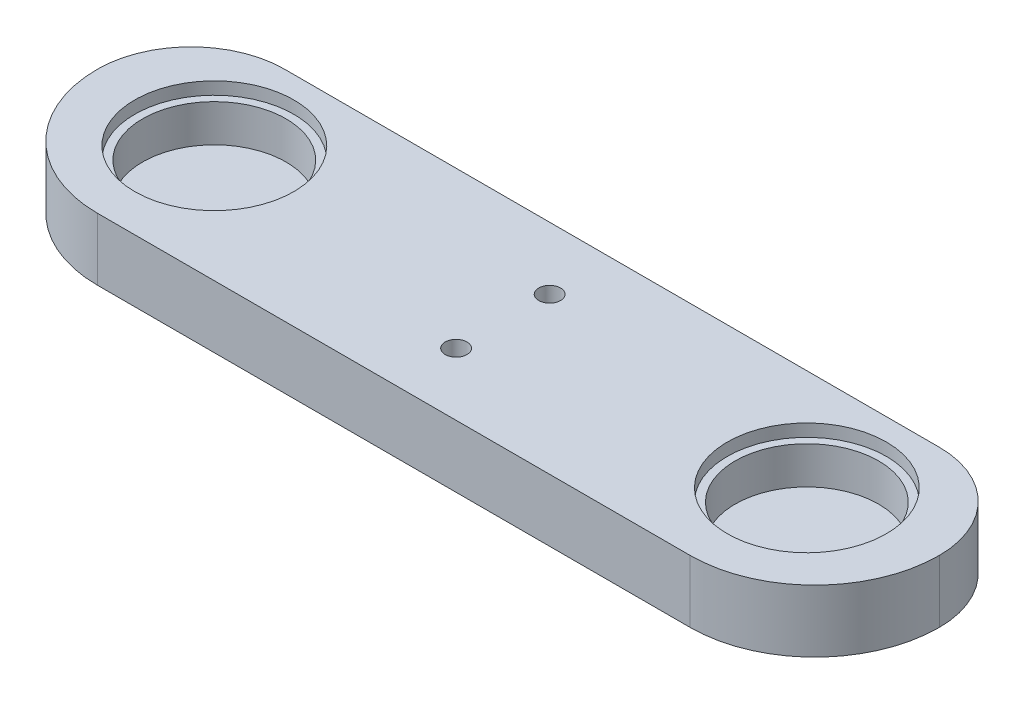
ISO-10303-21;
HEADER;
FILE_DESCRIPTION(('STEP AP214'),'2;1');
FILE_NAME('part.step','',(''),(''),'','','');
FILE_SCHEMA(('AUTOMOTIVE_DESIGN { 1 0 10303 214 1 1 1 1 }'));
ENDSEC;
DATA;
#1=APPLICATION_CONTEXT('core data for automotive mechanical design processes');
#2=APPLICATION_PROTOCOL_DEFINITION('international standard','automotive_design',2000,#1);
#3=PRODUCT_CONTEXT('',#1,'mechanical');
#4=PRODUCT('Part','Part','',(#3));
#5=PRODUCT_RELATED_PRODUCT_CATEGORY('part','',(#4));
#6=PRODUCT_DEFINITION_FORMATION('','',#4);
#7=PRODUCT_DEFINITION_CONTEXT('part definition',#1,'design');
#8=PRODUCT_DEFINITION('design','',#6,#7);
#9=PRODUCT_DEFINITION_SHAPE('','',#8);
#10=(LENGTH_UNIT() NAMED_UNIT(*) SI_UNIT(.MILLI.,.METRE.));
#11=(NAMED_UNIT(*) PLANE_ANGLE_UNIT() SI_UNIT($,.RADIAN.));
#12=(NAMED_UNIT(*) SI_UNIT($,.STERADIAN.) SOLID_ANGLE_UNIT());
#13=UNCERTAINTY_MEASURE_WITH_UNIT(LENGTH_MEASURE(1.E-05),#10,'distance_accuracy_value','');
#14=(GEOMETRIC_REPRESENTATION_CONTEXT(3) GLOBAL_UNCERTAINTY_ASSIGNED_CONTEXT((#13)) GLOBAL_UNIT_ASSIGNED_CONTEXT((#10,
#11,#12)) REPRESENTATION_CONTEXT('',''));
#15=CARTESIAN_POINT('',(0.,0.,0.));
#16=DIRECTION('',(0.,0.,1.));
#17=DIRECTION('',(1.,0.,0.));
#18=AXIS2_PLACEMENT_3D('',#15,#16,#17);
#19=CARTESIAN_POINT('',(19.7497982410927,-0.000999999999999265,15.6230701462917));
#20=DIRECTION('',(0.,1.,0.));
#21=DIRECTION('',(0.,0.,1.));
#22=AXIS2_PLACEMENT_3D('',#19,#20,#21);
#23=CYLINDRICAL_SURFACE('',#22,1.75);
#24=CARTESIAN_POINT('',(19.7497982410927,10.,15.6230701462917));
#25=DIRECTION('',(0.,1.,0.));
#26=DIRECTION('',(0.,0.,1.));
#27=AXIS2_PLACEMENT_3D('',#24,#25,#26);
#28=CIRCLE('',#27,1.75);
#29=CARTESIAN_POINT('',(19.7497982410927,10.,17.3730701462917));
#30=VERTEX_POINT('',#29);
#31=EDGE_CURVE('E134',#30,#30,#28,.T.);
#32=ORIENTED_EDGE('',*,*,#31,.T.);
#33=EDGE_LOOP('',(#32));
#34=FACE_BOUND('',#33,.T.);
#35=CARTESIAN_POINT('',(19.7497982410927,4.,15.6230701462917));
#36=DIRECTION('',(0.,-1.,0.));
#37=DIRECTION('',(0.,0.,-1.));
#38=AXIS2_PLACEMENT_3D('',#35,#36,#37);
#39=CIRCLE('',#38,1.75);
#40=CARTESIAN_POINT('',(19.7497982410927,4.,13.8730701462917));
#41=VERTEX_POINT('',#40);
#42=EDGE_CURVE('E130',#41,#41,#39,.F.);
#43=ORIENTED_EDGE('',*,*,#42,.F.);
#44=EDGE_LOOP('',(#43));
#45=FACE_BOUND('',#44,.T.);
#46=ADVANCED_FACE('F33',(#34,#45),#23,.F.);
#47=CARTESIAN_POINT('',(19.7497982410927,-0.000999999999999265,0.623070146291696));
#48=DIRECTION('',(0.,1.,0.));
#49=DIRECTION('',(0.,0.,1.));
#50=AXIS2_PLACEMENT_3D('',#47,#48,#49);
#51=CYLINDRICAL_SURFACE('',#50,1.75);
#52=CARTESIAN_POINT('',(19.7497982410927,10.,0.623070146291696));
#53=DIRECTION('',(0.,1.,0.));
#54=DIRECTION('',(0.,0.,1.));
#55=AXIS2_PLACEMENT_3D('',#52,#53,#54);
#56=CIRCLE('',#55,1.75);
#57=CARTESIAN_POINT('',(19.7497982410927,10.,2.37307014629169));
#58=VERTEX_POINT('',#57);
#59=EDGE_CURVE('E188',#58,#58,#56,.T.);
#60=ORIENTED_EDGE('',*,*,#59,.T.);
#61=EDGE_LOOP('',(#60));
#62=FACE_BOUND('',#61,.T.);
#63=CARTESIAN_POINT('',(19.7497982410927,4.,0.623070146291696));
#64=DIRECTION('',(0.,-1.,0.));
#65=DIRECTION('',(0.,0.,-1.));
#66=AXIS2_PLACEMENT_3D('',#63,#64,#65);
#67=CIRCLE('',#66,1.75);
#68=CARTESIAN_POINT('',(19.7497982410927,4.,-1.1269298537083));
#69=VERTEX_POINT('',#68);
#70=EDGE_CURVE('E127',#69,#69,#67,.F.);
#71=ORIENTED_EDGE('',*,*,#70,.F.);
#72=EDGE_LOOP('',(#71));
#73=FACE_BOUND('',#72,.T.);
#74=ADVANCED_FACE('F238',(#62,#73),#51,.F.);
#75=CARTESIAN_POINT('',(-47.7502017589073,10.,25.6230701462917));
#76=DIRECTION('',(0.,0.,-1.));
#77=DIRECTION('',(-1.,0.,0.));
#78=AXIS2_PLACEMENT_3D('',#75,#76,#77);
#79=PLANE('',#78);
#80=DIRECTION('',(1.,0.,0.));
#81=VECTOR('',#80,1.);
#82=CARTESIAN_POINT('',(-47.7502017589073,0.,25.6230701462917));
#83=LINE('',#82,#81);
#84=CARTESIAN_POINT('',(-27.7502017589073,0.,25.6230701462917));
#85=VERTEX_POINT('',#84);
#86=CARTESIAN_POINT('',(67.2497982410927,0.,25.6230701462917));
#87=VERTEX_POINT('',#86);
#88=EDGE_CURVE('E148',#85,#87,#83,.T.);
#89=ORIENTED_EDGE('',*,*,#88,.T.);
#90=DIRECTION('',(0.,-1.,0.));
#91=VECTOR('',#90,1.);
#92=CARTESIAN_POINT('',(67.2497982410927,10.,25.6230701462917));
#93=LINE('',#92,#91);
#94=CARTESIAN_POINT('',(67.2497982410927,10.,25.6230701462917));
#95=VERTEX_POINT('',#94);
#96=EDGE_CURVE('E103',#87,#95,#93,.F.);
#97=ORIENTED_EDGE('',*,*,#96,.T.);
#98=DIRECTION('',(1.,0.,0.));
#99=VECTOR('',#98,1.);
#100=CARTESIAN_POINT('',(-47.7502017589073,10.,25.6230701462917));
#101=LINE('',#100,#99);
#102=CARTESIAN_POINT('',(-27.7502017589073,10.,25.6230701462917));
#103=VERTEX_POINT('',#102);
#104=EDGE_CURVE('E112',#103,#95,#101,.T.);
#105=ORIENTED_EDGE('',*,*,#104,.F.);
#106=DIRECTION('',(0.,-1.,0.));
#107=VECTOR('',#106,1.);
#108=CARTESIAN_POINT('',(-27.7502017589073,10.,25.6230701462917));
#109=LINE('',#108,#107);
#110=EDGE_CURVE('E104',#103,#85,#109,.T.);
#111=ORIENTED_EDGE('',*,*,#110,.T.);
#112=EDGE_LOOP('',(#89,#97,#105,#111));
#113=FACE_BOUND('',#112,.T.);
#114=ADVANCED_FACE('F150',(#113),#79,.F.);
#115=CARTESIAN_POINT('',(-47.7502017589073,10.,-9.3769298537083));
#116=DIRECTION('',(0.,0.,1.));
#117=DIRECTION('',(1.,0.,0.));
#118=AXIS2_PLACEMENT_3D('',#115,#116,#117);
#119=PLANE('',#118);
#120=DIRECTION('',(-1.,0.,0.));
#121=VECTOR('',#120,1.);
#122=CARTESIAN_POINT('',(-47.7502017589073,10.,-9.3769298537083));
#123=LINE('',#122,#121);
#124=CARTESIAN_POINT('',(72.2497982410927,10.,-9.3769298537083));
#125=VERTEX_POINT('',#124);
#126=CARTESIAN_POINT('',(-32.7502017589073,10.,-9.3769298537083));
#127=VERTEX_POINT('',#126);
#128=EDGE_CURVE('E108',#125,#127,#123,.T.);
#129=ORIENTED_EDGE('',*,*,#128,.F.);
#130=DIRECTION('',(0.,-1.,0.));
#131=VECTOR('',#130,1.);
#132=CARTESIAN_POINT('',(72.2497982410927,10.,-9.3769298537083));
#133=LINE('',#132,#131);
#134=CARTESIAN_POINT('',(72.2497982410927,0.,-9.3769298537083));
#135=VERTEX_POINT('',#134);
#136=EDGE_CURVE('E136',#125,#135,#133,.T.);
#137=ORIENTED_EDGE('',*,*,#136,.T.);
#138=DIRECTION('',(-1.,0.,0.));
#139=VECTOR('',#138,1.);
#140=CARTESIAN_POINT('',(-47.7502017589073,0.,-9.3769298537083));
#141=LINE('',#140,#139);
#142=CARTESIAN_POINT('',(-32.7502017589073,0.,-9.3769298537083));
#143=VERTEX_POINT('',#142);
#144=EDGE_CURVE('E90',#135,#143,#141,.T.);
#145=ORIENTED_EDGE('',*,*,#144,.T.);
#146=DIRECTION('',(0.,-1.,0.));
#147=VECTOR('',#146,1.);
#148=CARTESIAN_POINT('',(-32.7502017589073,10.,-9.3769298537083));
#149=LINE('',#148,#147);
#150=EDGE_CURVE('E48',#143,#127,#149,.F.);
#151=ORIENTED_EDGE('',*,*,#150,.T.);
#152=EDGE_LOOP('',(#129,#137,#145,#151));
#153=FACE_BOUND('',#152,.T.);
#154=ADVANCED_FACE('F276',(#153),#119,.F.);
#155=CARTESIAN_POINT('',(0.,10.,0.));
#156=DIRECTION('',(0.,1.,0.));
#157=DIRECTION('',(0.,0.,1.));
#158=AXIS2_PLACEMENT_3D('',#155,#156,#157);
#159=PLANE('',#158);
#160=ORIENTED_EDGE('',*,*,#59,.F.);
#161=EDGE_LOOP('',(#160));
#162=FACE_BOUND('',#161,.T.);
#163=ORIENTED_EDGE('',*,*,#31,.F.);
#164=EDGE_LOOP('',(#163));
#165=FACE_BOUND('',#164,.T.);
#166=CARTESIAN_POINT('',(-27.7502017589073,10.,6.88629089006511));
#167=DIRECTION('',(0.,1.,0.));
#168=DIRECTION('',(0.,0.,1.));
#169=AXIS2_PLACEMENT_3D('',#166,#167,#168);
#170=CIRCLE('',#169,12.75);
#171=CARTESIAN_POINT('',(-27.7502017589073,10.,19.6362908900651));
#172=VERTEX_POINT('',#171);
#173=EDGE_CURVE('E157',#172,#172,#170,.T.);
#174=ORIENTED_EDGE('',*,*,#173,.F.);
#175=EDGE_LOOP('',(#174));
#176=FACE_BOUND('',#175,.T.);
#177=CARTESIAN_POINT('',(67.2497982410927,10.,6.88629089006511));
#178=DIRECTION('',(0.,1.,0.));
#179=DIRECTION('',(0.,0.,-1.));
#180=AXIS2_PLACEMENT_3D('',#177,#178,#179);
#181=CIRCLE('',#180,12.75);
#182=CARTESIAN_POINT('',(67.2497982410927,10.,-5.86370910993491));
#183=VERTEX_POINT('',#182);
#184=EDGE_CURVE('E153',#183,#183,#181,.T.);
#185=ORIENTED_EDGE('',*,*,#184,.F.);
#186=EDGE_LOOP('',(#185));
#187=FACE_BOUND('',#186,.T.);
#188=CARTESIAN_POINT('',(67.2497982410927,10.,5.6230701462917));
#189=DIRECTION('',(0.,1.,0.));
#190=DIRECTION('',(0.,0.,1.));
#191=AXIS2_PLACEMENT_3D('',#188,#189,#190);
#192=CIRCLE('',#191,20.);
#193=CARTESIAN_POINT('',(87.2497982410927,10.,5.6230701462917));
#194=VERTEX_POINT('',#193);
#195=EDGE_CURVE('E122',#95,#194,#192,.T.);
#196=ORIENTED_EDGE('',*,*,#195,.T.);
#197=CARTESIAN_POINT('',(72.2497982410927,10.,5.62307014629169));
#198=DIRECTION('',(0.,1.,0.));
#199=DIRECTION('',(0.,0.,1.));
#200=AXIS2_PLACEMENT_3D('',#197,#198,#199);
#201=CIRCLE('',#200,15.);
#202=EDGE_CURVE('E11',#194,#125,#201,.T.);
#203=ORIENTED_EDGE('',*,*,#202,.T.);
#204=ORIENTED_EDGE('',*,*,#128,.T.);
#205=CARTESIAN_POINT('',(-32.7502017589073,10.,5.62307014629169));
#206=DIRECTION('',(0.,1.,0.));
#207=DIRECTION('',(0.,0.,1.));
#208=AXIS2_PLACEMENT_3D('',#205,#206,#207);
#209=CIRCLE('',#208,15.);
#210=CARTESIAN_POINT('',(-47.7502017589073,10.,5.6230701462917));
#211=VERTEX_POINT('',#210);
#212=EDGE_CURVE('E41',#127,#211,#209,.T.);
#213=ORIENTED_EDGE('',*,*,#212,.T.);
#214=CARTESIAN_POINT('',(-27.7502017589073,10.,5.6230701462917));
#215=DIRECTION('',(0.,1.,0.));
#216=DIRECTION('',(0.,0.,1.));
#217=AXIS2_PLACEMENT_3D('',#214,#215,#216);
#218=CIRCLE('',#217,20.);
#219=EDGE_CURVE('E120',#211,#103,#218,.T.);
#220=ORIENTED_EDGE('',*,*,#219,.T.);
#221=ORIENTED_EDGE('',*,*,#104,.T.);
#222=EDGE_LOOP('',(#196,#203,#204,#213,#220,#221));
#223=FACE_BOUND('',#222,.T.);
#224=ADVANCED_FACE('F140',(#162,#165,#176,#187,#223),#159,.T.);
#225=CARTESIAN_POINT('',(0.,0.,0.));
#226=DIRECTION('',(0.,1.,0.));
#227=DIRECTION('',(0.,0.,1.));
#228=AXIS2_PLACEMENT_3D('',#225,#226,#227);
#229=PLANE('',#228);
#230=CARTESIAN_POINT('',(19.7497982410927,0.,15.6230701462917));
#231=DIRECTION('',(0.,-1.,0.));
#232=DIRECTION('',(0.,0.,-1.));
#233=AXIS2_PLACEMENT_3D('',#230,#231,#232);
#234=CIRCLE('',#233,3.1);
#235=CARTESIAN_POINT('',(19.7497982410927,0.,12.5230701462917));
#236=VERTEX_POINT('',#235);
#237=EDGE_CURVE('E202',#236,#236,#234,.T.);
#238=ORIENTED_EDGE('',*,*,#237,.F.);
#239=EDGE_LOOP('',(#238));
#240=FACE_BOUND('',#239,.T.);
#241=CARTESIAN_POINT('',(19.7497982410927,0.,0.623070146291696));
#242=DIRECTION('',(0.,-1.,0.));
#243=DIRECTION('',(0.,0.,-1.));
#244=AXIS2_PLACEMENT_3D('',#241,#242,#243);
#245=CIRCLE('',#244,3.1);
#246=CARTESIAN_POINT('',(19.7497982410927,0.,-2.47692985370831));
#247=VERTEX_POINT('',#246);
#248=EDGE_CURVE('E196',#247,#247,#245,.T.);
#249=ORIENTED_EDGE('',*,*,#248,.F.);
#250=EDGE_LOOP('',(#249));
#251=FACE_BOUND('',#250,.T.);
#252=ORIENTED_EDGE('',*,*,#144,.F.);
#253=CARTESIAN_POINT('',(72.2497982410927,0.,5.62307014629169));
#254=DIRECTION('',(0.,1.,0.));
#255=DIRECTION('',(0.,0.,1.));
#256=AXIS2_PLACEMENT_3D('',#253,#254,#255);
#257=CIRCLE('',#256,15.);
#258=CARTESIAN_POINT('',(87.2497982410927,0.,5.6230701462917));
#259=VERTEX_POINT('',#258);
#260=EDGE_CURVE('E84',#135,#259,#257,.F.);
#261=ORIENTED_EDGE('',*,*,#260,.T.);
#262=CARTESIAN_POINT('',(67.2497982410927,0.,5.6230701462917));
#263=DIRECTION('',(0.,1.,0.));
#264=DIRECTION('',(0.,0.,1.));
#265=AXIS2_PLACEMENT_3D('',#262,#263,#264);
#266=CIRCLE('',#265,20.);
#267=EDGE_CURVE('E88',#259,#87,#266,.F.);
#268=ORIENTED_EDGE('',*,*,#267,.T.);
#269=ORIENTED_EDGE('',*,*,#88,.F.);
#270=CARTESIAN_POINT('',(-27.7502017589073,0.,5.6230701462917));
#271=DIRECTION('',(0.,1.,0.));
#272=DIRECTION('',(0.,0.,1.));
#273=AXIS2_PLACEMENT_3D('',#270,#271,#272);
#274=CIRCLE('',#273,20.);
#275=CARTESIAN_POINT('',(-47.7502017589073,0.,5.6230701462917));
#276=VERTEX_POINT('',#275);
#277=EDGE_CURVE('E105',#85,#276,#274,.F.);
#278=ORIENTED_EDGE('',*,*,#277,.T.);
#279=CARTESIAN_POINT('',(-32.7502017589073,0.,5.62307014629169));
#280=DIRECTION('',(0.,1.,0.));
#281=DIRECTION('',(0.,0.,1.));
#282=AXIS2_PLACEMENT_3D('',#279,#280,#281);
#283=CIRCLE('',#282,15.);
#284=EDGE_CURVE('E95',#276,#143,#283,.F.);
#285=ORIENTED_EDGE('',*,*,#284,.T.);
#286=EDGE_LOOP('',(#252,#261,#268,#269,#278,#285));
#287=FACE_BOUND('',#286,.T.);
#288=ADVANCED_FACE('F86',(#240,#251,#287),#229,.F.);
#289=CARTESIAN_POINT('',(67.2497982410927,10.,5.6230701462917));
#290=DIRECTION('',(0.,-1.,0.));
#291=DIRECTION('',(0.,0.,-1.));
#292=AXIS2_PLACEMENT_3D('',#289,#290,#291);
#293=CYLINDRICAL_SURFACE('',#292,20.);
#294=ORIENTED_EDGE('',*,*,#195,.F.);
#295=ORIENTED_EDGE('',*,*,#96,.F.);
#296=ORIENTED_EDGE('',*,*,#267,.F.);
#297=DIRECTION('',(0.,-1.,0.));
#298=VECTOR('',#297,1.);
#299=CARTESIAN_POINT('',(87.2497982410927,10.,5.6230701462917));
#300=LINE('',#299,#298);
#301=EDGE_CURVE('E102',#194,#259,#300,.T.);
#302=ORIENTED_EDGE('',*,*,#301,.F.);
#303=EDGE_LOOP('',(#294,#295,#296,#302));
#304=FACE_BOUND('',#303,.T.);
#305=ADVANCED_FACE('F101',(#304),#293,.T.);
#306=CARTESIAN_POINT('',(-27.7502017589073,10.,5.6230701462917));
#307=DIRECTION('',(0.,-1.,0.));
#308=DIRECTION('',(0.,0.,-1.));
#309=AXIS2_PLACEMENT_3D('',#306,#307,#308);
#310=CYLINDRICAL_SURFACE('',#309,20.);
#311=ORIENTED_EDGE('',*,*,#219,.F.);
#312=DIRECTION('',(0.,-1.,0.));
#313=VECTOR('',#312,1.);
#314=CARTESIAN_POINT('',(-47.7502017589073,10.,5.6230701462917));
#315=LINE('',#314,#313);
#316=EDGE_CURVE('E124',#276,#211,#315,.F.);
#317=ORIENTED_EDGE('',*,*,#316,.F.);
#318=ORIENTED_EDGE('',*,*,#277,.F.);
#319=ORIENTED_EDGE('',*,*,#110,.F.);
#320=EDGE_LOOP('',(#311,#317,#318,#319));
#321=FACE_BOUND('',#320,.T.);
#322=ADVANCED_FACE('F147',(#321),#310,.T.);
#323=CARTESIAN_POINT('',(67.2497982410927,8.,6.88629089006511));
#324=DIRECTION('',(0.,1.,0.));
#325=DIRECTION('',(0.,0.,1.));
#326=AXIS2_PLACEMENT_3D('',#323,#324,#325);
#327=CYLINDRICAL_SURFACE('',#326,12.75);
#328=CARTESIAN_POINT('',(67.2497982410927,8.,6.88629089006511));
#329=DIRECTION('',(0.,1.,0.));
#330=DIRECTION('',(0.,0.,-1.));
#331=AXIS2_PLACEMENT_3D('',#328,#329,#330);
#332=CIRCLE('',#331,12.75);
#333=CARTESIAN_POINT('',(67.2497982410927,8.,-5.86370910993491));
#334=VERTEX_POINT('',#333);
#335=EDGE_CURVE('E162',#334,#334,#332,.T.);
#336=ORIENTED_EDGE('',*,*,#335,.F.);
#337=EDGE_LOOP('',(#336));
#338=FACE_BOUND('',#337,.T.);
#339=ORIENTED_EDGE('',*,*,#184,.T.);
#340=EDGE_LOOP('',(#339));
#341=FACE_BOUND('',#340,.T.);
#342=ADVANCED_FACE('F270',(#338,#341),#327,.F.);
#343=CARTESIAN_POINT('',(67.2497982410927,8.,6.88629089006511));
#344=DIRECTION('',(0.,-1.,0.));
#345=DIRECTION('',(0.,0.,-1.));
#346=AXIS2_PLACEMENT_3D('',#343,#344,#345);
#347=PLANE('',#346);
#348=CARTESIAN_POINT('',(67.2497982410927,8.,6.88629089006511));
#349=DIRECTION('',(0.,1.,0.));
#350=DIRECTION('',(0.,0.,-1.));
#351=AXIS2_PLACEMENT_3D('',#348,#349,#350);
#352=CIRCLE('',#351,11.5);
#353=CARTESIAN_POINT('',(67.2497982410927,8.,-4.6137091099349));
#354=VERTEX_POINT('',#353);
#355=EDGE_CURVE('E165',#354,#354,#352,.T.);
#356=ORIENTED_EDGE('',*,*,#355,.F.);
#357=EDGE_LOOP('',(#356));
#358=FACE_BOUND('',#357,.T.);
#359=ORIENTED_EDGE('',*,*,#335,.T.);
#360=EDGE_LOOP('',(#359));
#361=FACE_BOUND('',#360,.T.);
#362=ADVANCED_FACE('F266',(#358,#361),#347,.F.);
#363=CARTESIAN_POINT('',(-27.7502017589073,8.,6.88629089006511));
#364=DIRECTION('',(0.,1.,0.));
#365=DIRECTION('',(0.,0.,1.));
#366=AXIS2_PLACEMENT_3D('',#363,#364,#365);
#367=CYLINDRICAL_SURFACE('',#366,12.75);
#368=CARTESIAN_POINT('',(-27.7502017589073,8.,6.88629089006511));
#369=DIRECTION('',(0.,1.,0.));
#370=DIRECTION('',(0.,0.,1.));
#371=AXIS2_PLACEMENT_3D('',#368,#369,#370);
#372=CIRCLE('',#371,12.75);
#373=CARTESIAN_POINT('',(-27.7502017589073,8.,19.6362908900651));
#374=VERTEX_POINT('',#373);
#375=EDGE_CURVE('E155',#374,#374,#372,.T.);
#376=ORIENTED_EDGE('',*,*,#375,.F.);
#377=EDGE_LOOP('',(#376));
#378=FACE_BOUND('',#377,.T.);
#379=ORIENTED_EDGE('',*,*,#173,.T.);
#380=EDGE_LOOP('',(#379));
#381=FACE_BOUND('',#380,.T.);
#382=ADVANCED_FACE('F262',(#378,#381),#367,.F.);
#383=CARTESIAN_POINT('',(-27.7502017589073,8.,6.88629089006511));
#384=DIRECTION('',(0.,1.,0.));
#385=DIRECTION('',(0.,0.,1.));
#386=AXIS2_PLACEMENT_3D('',#383,#384,#385);
#387=PLANE('',#386);
#388=CARTESIAN_POINT('',(-27.7502017589073,8.,6.88629089006511));
#389=DIRECTION('',(0.,1.,0.));
#390=DIRECTION('',(0.,0.,1.));
#391=AXIS2_PLACEMENT_3D('',#388,#389,#390);
#392=CIRCLE('',#391,11.5);
#393=CARTESIAN_POINT('',(-27.7502017589073,8.,18.3862908900651));
#394=VERTEX_POINT('',#393);
#395=EDGE_CURVE('E175',#394,#394,#392,.T.);
#396=ORIENTED_EDGE('',*,*,#395,.F.);
#397=EDGE_LOOP('',(#396));
#398=FACE_BOUND('',#397,.T.);
#399=ORIENTED_EDGE('',*,*,#375,.T.);
#400=EDGE_LOOP('',(#399));
#401=FACE_BOUND('',#400,.T.);
#402=ADVANCED_FACE('F253',(#398,#401),#387,.T.);
#403=CARTESIAN_POINT('',(-27.7502017589073,2.,6.88629089006511));
#404=DIRECTION('',(0.,1.,0.));
#405=DIRECTION('',(0.,0.,1.));
#406=AXIS2_PLACEMENT_3D('',#403,#404,#405);
#407=CYLINDRICAL_SURFACE('',#406,11.5);
#408=CARTESIAN_POINT('',(-27.7502017589073,2.,6.88629089006511));
#409=DIRECTION('',(0.,1.,0.));
#410=DIRECTION('',(0.,0.,1.));
#411=AXIS2_PLACEMENT_3D('',#408,#409,#410);
#412=CIRCLE('',#411,11.5);
#413=CARTESIAN_POINT('',(-27.7502017589073,2.,18.3862908900651));
#414=VERTEX_POINT('',#413);
#415=EDGE_CURVE('E171',#414,#414,#412,.T.);
#416=ORIENTED_EDGE('',*,*,#415,.F.);
#417=EDGE_LOOP('',(#416));
#418=FACE_BOUND('',#417,.T.);
#419=ORIENTED_EDGE('',*,*,#395,.T.);
#420=EDGE_LOOP('',(#419));
#421=FACE_BOUND('',#420,.T.);
#422=ADVANCED_FACE('F250',(#418,#421),#407,.F.);
#423=CARTESIAN_POINT('',(-27.7502017589073,2.,6.88629089006511));
#424=DIRECTION('',(0.,1.,0.));
#425=DIRECTION('',(0.,0.,1.));
#426=AXIS2_PLACEMENT_3D('',#423,#424,#425);
#427=PLANE('',#426);
#428=ORIENTED_EDGE('',*,*,#415,.T.);
#429=EDGE_LOOP('',(#428));
#430=FACE_BOUND('',#429,.T.);
#431=ADVANCED_FACE('F246',(#430),#427,.T.);
#432=CARTESIAN_POINT('',(67.2497982410927,2.,6.88629089006511));
#433=DIRECTION('',(0.,1.,0.));
#434=DIRECTION('',(0.,0.,1.));
#435=AXIS2_PLACEMENT_3D('',#432,#433,#434);
#436=CYLINDRICAL_SURFACE('',#435,11.5);
#437=CARTESIAN_POINT('',(67.2497982410927,2.,6.88629089006511));
#438=DIRECTION('',(0.,1.,0.));
#439=DIRECTION('',(0.,0.,-1.));
#440=AXIS2_PLACEMENT_3D('',#437,#438,#439);
#441=CIRCLE('',#440,11.5);
#442=CARTESIAN_POINT('',(67.2497982410927,2.,-4.6137091099349));
#443=VERTEX_POINT('',#442);
#444=EDGE_CURVE('E180',#443,#443,#441,.T.);
#445=ORIENTED_EDGE('',*,*,#444,.F.);
#446=EDGE_LOOP('',(#445));
#447=FACE_BOUND('',#446,.T.);
#448=ORIENTED_EDGE('',*,*,#355,.T.);
#449=EDGE_LOOP('',(#448));
#450=FACE_BOUND('',#449,.T.);
#451=ADVANCED_FACE('F249',(#447,#450),#436,.F.);
#452=CARTESIAN_POINT('',(67.2497982410927,2.,6.88629089006511));
#453=DIRECTION('',(0.,-1.,0.));
#454=DIRECTION('',(0.,0.,-1.));
#455=AXIS2_PLACEMENT_3D('',#452,#453,#454);
#456=PLANE('',#455);
#457=ORIENTED_EDGE('',*,*,#444,.T.);
#458=EDGE_LOOP('',(#457));
#459=FACE_BOUND('',#458,.T.);
#460=ADVANCED_FACE('F232',(#459),#456,.F.);
#461=CARTESIAN_POINT('',(19.7497982410927,4.,0.623070146291696));
#462=DIRECTION('',(0.,-1.,0.));
#463=DIRECTION('',(0.,0.,-1.));
#464=AXIS2_PLACEMENT_3D('',#461,#462,#463);
#465=PLANE('',#464);
#466=CARTESIAN_POINT('',(19.7497982410927,4.,0.623070146291696));
#467=DIRECTION('',(0.,-1.,0.));
#468=DIRECTION('',(0.,0.,-1.));
#469=AXIS2_PLACEMENT_3D('',#466,#467,#468);
#470=CIRCLE('',#469,3.1);
#471=CARTESIAN_POINT('',(19.7497982410927,4.,-2.47692985370831));
#472=VERTEX_POINT('',#471);
#473=EDGE_CURVE('E199',#472,#472,#470,.T.);
#474=ORIENTED_EDGE('',*,*,#473,.T.);
#475=EDGE_LOOP('',(#474));
#476=FACE_BOUND('',#475,.T.);
#477=ORIENTED_EDGE('',*,*,#70,.T.);
#478=EDGE_LOOP('',(#477));
#479=FACE_BOUND('',#478,.T.);
#480=ADVANCED_FACE('F224',(#476,#479),#465,.T.);
#481=CARTESIAN_POINT('',(19.7497982410927,4.,0.623070146291696));
#482=DIRECTION('',(0.,-1.,0.));
#483=DIRECTION('',(0.,0.,-1.));
#484=AXIS2_PLACEMENT_3D('',#481,#482,#483);
#485=CYLINDRICAL_SURFACE('',#484,3.1);
#486=ORIENTED_EDGE('',*,*,#473,.F.);
#487=EDGE_LOOP('',(#486));
#488=FACE_BOUND('',#487,.T.);
#489=ORIENTED_EDGE('',*,*,#248,.T.);
#490=EDGE_LOOP('',(#489));
#491=FACE_BOUND('',#490,.T.);
#492=ADVANCED_FACE('F222',(#488,#491),#485,.F.);
#493=CARTESIAN_POINT('',(19.7497982410927,4.,15.6230701462917));
#494=DIRECTION('',(0.,-1.,0.));
#495=DIRECTION('',(0.,0.,-1.));
#496=AXIS2_PLACEMENT_3D('',#493,#494,#495);
#497=PLANE('',#496);
#498=CARTESIAN_POINT('',(19.7497982410927,4.,15.6230701462917));
#499=DIRECTION('',(0.,-1.,0.));
#500=DIRECTION('',(0.,0.,-1.));
#501=AXIS2_PLACEMENT_3D('',#498,#499,#500);
#502=CIRCLE('',#501,3.1);
#503=CARTESIAN_POINT('',(19.7497982410927,4.,12.5230701462917));
#504=VERTEX_POINT('',#503);
#505=EDGE_CURVE('E131',#504,#504,#502,.T.);
#506=ORIENTED_EDGE('',*,*,#505,.T.);
#507=EDGE_LOOP('',(#506));
#508=FACE_BOUND('',#507,.T.);
#509=ORIENTED_EDGE('',*,*,#42,.T.);
#510=EDGE_LOOP('',(#509));
#511=FACE_BOUND('',#510,.T.);
#512=ADVANCED_FACE('F208',(#508,#511),#497,.T.);
#513=CARTESIAN_POINT('',(19.7497982410927,4.,15.6230701462917));
#514=DIRECTION('',(0.,-1.,0.));
#515=DIRECTION('',(0.,0.,-1.));
#516=AXIS2_PLACEMENT_3D('',#513,#514,#515);
#517=CYLINDRICAL_SURFACE('',#516,3.1);
#518=ORIENTED_EDGE('',*,*,#505,.F.);
#519=EDGE_LOOP('',(#518));
#520=FACE_BOUND('',#519,.T.);
#521=ORIENTED_EDGE('',*,*,#237,.T.);
#522=EDGE_LOOP('',(#521));
#523=FACE_BOUND('',#522,.T.);
#524=ADVANCED_FACE('F211',(#520,#523),#517,.F.);
#525=CARTESIAN_POINT('',(72.2497982410927,10.,5.62307014629169));
#526=DIRECTION('',(0.,-1.,0.));
#527=DIRECTION('',(0.,0.,-1.));
#528=AXIS2_PLACEMENT_3D('',#525,#526,#527);
#529=CYLINDRICAL_SURFACE('',#528,15.);
#530=ORIENTED_EDGE('',*,*,#202,.F.);
#531=ORIENTED_EDGE('',*,*,#301,.T.);
#532=ORIENTED_EDGE('',*,*,#260,.F.);
#533=ORIENTED_EDGE('',*,*,#136,.F.);
#534=EDGE_LOOP('',(#530,#531,#532,#533));
#535=FACE_BOUND('',#534,.T.);
#536=ADVANCED_FACE('F107',(#535),#529,.T.);
#537=CARTESIAN_POINT('',(-32.7502017589073,10.,5.62307014629169));
#538=DIRECTION('',(0.,-1.,0.));
#539=DIRECTION('',(0.,0.,-1.));
#540=AXIS2_PLACEMENT_3D('',#537,#538,#539);
#541=CYLINDRICAL_SURFACE('',#540,15.);
#542=ORIENTED_EDGE('',*,*,#212,.F.);
#543=ORIENTED_EDGE('',*,*,#150,.F.);
#544=ORIENTED_EDGE('',*,*,#284,.F.);
#545=ORIENTED_EDGE('',*,*,#316,.T.);
#546=EDGE_LOOP('',(#542,#543,#544,#545));
#547=FACE_BOUND('',#546,.T.);
#548=ADVANCED_FACE('F35',(#547),#541,.T.);
#549=CLOSED_SHELL('',(#46,#74,#114,#154,#224,#288,#305,#322,#342,#362,#382,#402,#422,#431,#451,
#460,#480,#492,#512,#524,#536,#548));
#550=MANIFOLD_SOLID_BREP('B2',#549);
#551=ADVANCED_BREP_SHAPE_REPRESENTATION('',(#18,#550),#14);
#552=SHAPE_DEFINITION_REPRESENTATION(#9,#551);
ENDSEC;
END-ISO-10303-21;
